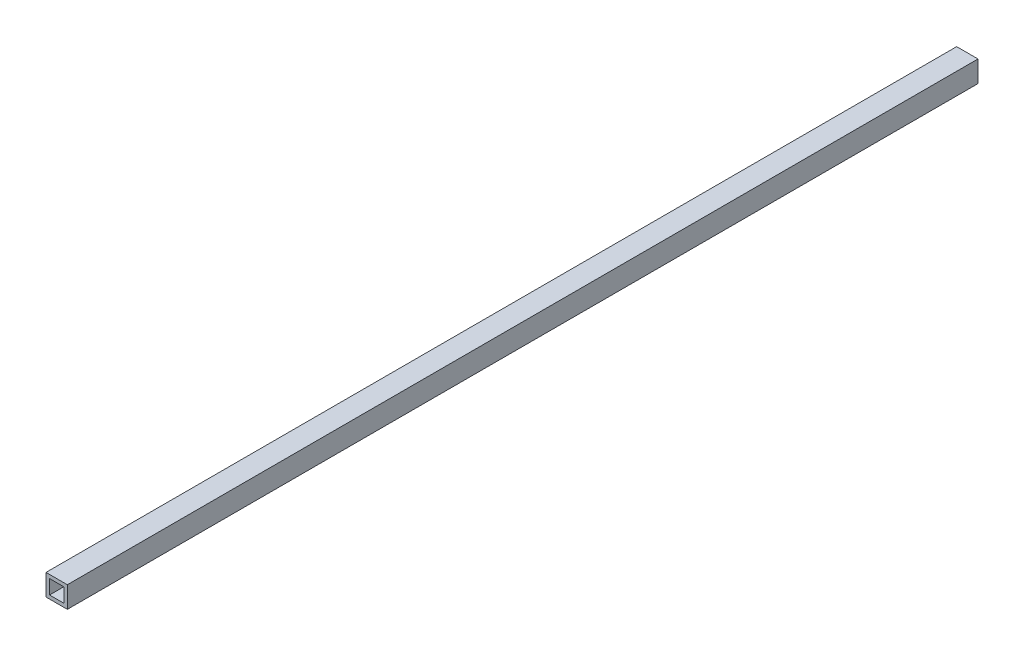
ISO-10303-21;
HEADER;
FILE_DESCRIPTION(('STEP AP214'),'2;1');
FILE_NAME('part.step','',(''),(''),'','','');
FILE_SCHEMA(('AUTOMOTIVE_DESIGN { 1 0 10303 214 1 1 1 1 }'));
ENDSEC;
DATA;
#1=APPLICATION_CONTEXT('core data for automotive mechanical design processes');
#2=APPLICATION_PROTOCOL_DEFINITION('international standard','automotive_design',2000,#1);
#3=PRODUCT_CONTEXT('',#1,'mechanical');
#4=PRODUCT('Part','Part','',(#3));
#5=PRODUCT_RELATED_PRODUCT_CATEGORY('part','',(#4));
#6=PRODUCT_DEFINITION_FORMATION('','',#4);
#7=PRODUCT_DEFINITION_CONTEXT('part definition',#1,'design');
#8=PRODUCT_DEFINITION('design','',#6,#7);
#9=PRODUCT_DEFINITION_SHAPE('','',#8);
#10=(LENGTH_UNIT() NAMED_UNIT(*) SI_UNIT(.MILLI.,.METRE.));
#11=(NAMED_UNIT(*) PLANE_ANGLE_UNIT() SI_UNIT($,.RADIAN.));
#12=(NAMED_UNIT(*) SI_UNIT($,.STERADIAN.) SOLID_ANGLE_UNIT());
#13=UNCERTAINTY_MEASURE_WITH_UNIT(LENGTH_MEASURE(1.E-05),#10,'distance_accuracy_value','');
#14=(GEOMETRIC_REPRESENTATION_CONTEXT(3) GLOBAL_UNCERTAINTY_ASSIGNED_CONTEXT((#13)) GLOBAL_UNIT_ASSIGNED_CONTEXT((#10,
#11,#12)) REPRESENTATION_CONTEXT('',''));
#15=CARTESIAN_POINT('',(0.,0.,0.));
#16=DIRECTION('',(0.,0.,1.));
#17=DIRECTION('',(1.,0.,0.));
#18=AXIS2_PLACEMENT_3D('',#15,#16,#17);
#19=CARTESIAN_POINT('',(392.168972332016,203.2,812.8));
#20=DIRECTION('',(1.,0.,0.));
#21=DIRECTION('',(0.,1.,0.));
#22=AXIS2_PLACEMENT_3D('',#19,#20,#21);
#23=PLANE('',#22);
#24=DIRECTION('',(0.,-1.,0.));
#25=VECTOR('',#24,1.);
#26=CARTESIAN_POINT('',(392.168972332016,203.2,0.));
#27=LINE('',#26,#25);
#28=CARTESIAN_POINT('',(392.168972332016,203.2,0.));
#29=VERTEX_POINT('',#28);
#30=CARTESIAN_POINT('',(392.168972332016,184.15,0.));
#31=VERTEX_POINT('',#30);
#32=EDGE_CURVE('E130',#29,#31,#27,.T.);
#33=ORIENTED_EDGE('',*,*,#32,.T.);
#34=DIRECTION('',(0.,0.,-1.));
#35=VECTOR('',#34,1.);
#36=CARTESIAN_POINT('',(392.168972332016,184.15,812.8));
#37=LINE('',#36,#35);
#38=CARTESIAN_POINT('',(392.168972332016,184.15,812.8));
#39=VERTEX_POINT('',#38);
#40=EDGE_CURVE('E11',#39,#31,#37,.T.);
#41=ORIENTED_EDGE('',*,*,#40,.F.);
#42=DIRECTION('',(0.,-1.,0.));
#43=VECTOR('',#42,1.);
#44=CARTESIAN_POINT('',(392.168972332016,203.2,812.8));
#45=LINE('',#44,#43);
#46=CARTESIAN_POINT('',(392.168972332016,203.2,812.8));
#47=VERTEX_POINT('',#46);
#48=EDGE_CURVE('E134',#47,#39,#45,.T.);
#49=ORIENTED_EDGE('',*,*,#48,.F.);
#50=DIRECTION('',(0.,0.,-1.));
#51=VECTOR('',#50,1.);
#52=CARTESIAN_POINT('',(392.168972332016,203.2,812.8));
#53=LINE('',#52,#51);
#54=EDGE_CURVE('E144',#47,#29,#53,.T.);
#55=ORIENTED_EDGE('',*,*,#54,.T.);
#56=EDGE_LOOP('',(#33,#41,#49,#55));
#57=FACE_BOUND('',#56,.T.);
#58=ADVANCED_FACE('F33',(#57),#23,.F.);
#59=CARTESIAN_POINT('',(392.168972332016,184.15,812.8));
#60=DIRECTION('',(0.,1.,0.));
#61=DIRECTION('',(-1.,0.,0.));
#62=AXIS2_PLACEMENT_3D('',#59,#60,#61);
#63=PLANE('',#62);
#64=DIRECTION('',(1.,0.,0.));
#65=VECTOR('',#64,1.);
#66=CARTESIAN_POINT('',(392.168972332016,184.15,0.));
#67=LINE('',#66,#65);
#68=CARTESIAN_POINT('',(411.218972332016,184.15,0.));
#69=VERTEX_POINT('',#68);
#70=EDGE_CURVE('E147',#31,#69,#67,.T.);
#71=ORIENTED_EDGE('',*,*,#70,.T.);
#72=DIRECTION('',(0.,0.,-1.));
#73=VECTOR('',#72,1.);
#74=CARTESIAN_POINT('',(411.218972332016,184.15,812.8));
#75=LINE('',#74,#73);
#76=CARTESIAN_POINT('',(411.218972332016,184.15,812.8));
#77=VERTEX_POINT('',#76);
#78=EDGE_CURVE('E40',#77,#69,#75,.T.);
#79=ORIENTED_EDGE('',*,*,#78,.F.);
#80=DIRECTION('',(1.,0.,0.));
#81=VECTOR('',#80,1.);
#82=CARTESIAN_POINT('',(392.168972332016,184.15,812.8));
#83=LINE('',#82,#81);
#84=EDGE_CURVE('E137',#39,#77,#83,.T.);
#85=ORIENTED_EDGE('',*,*,#84,.F.);
#86=ORIENTED_EDGE('',*,*,#40,.T.);
#87=EDGE_LOOP('',(#71,#79,#85,#86));
#88=FACE_BOUND('',#87,.T.);
#89=ADVANCED_FACE('F175',(#88),#63,.F.);
#90=CARTESIAN_POINT('',(411.218972332016,203.2,812.8));
#91=DIRECTION('',(-1.,0.,0.));
#92=DIRECTION('',(0.,-1.,0.));
#93=AXIS2_PLACEMENT_3D('',#90,#91,#92);
#94=PLANE('',#93);
#95=DIRECTION('',(0.,1.,0.));
#96=VECTOR('',#95,1.);
#97=CARTESIAN_POINT('',(411.218972332016,203.2,0.));
#98=LINE('',#97,#96);
#99=CARTESIAN_POINT('',(411.218972332016,203.2,0.));
#100=VERTEX_POINT('',#99);
#101=EDGE_CURVE('E149',#69,#100,#98,.T.);
#102=ORIENTED_EDGE('',*,*,#101,.T.);
#103=DIRECTION('',(0.,0.,-1.));
#104=VECTOR('',#103,1.);
#105=CARTESIAN_POINT('',(411.218972332016,203.2,812.8));
#106=LINE('',#105,#104);
#107=CARTESIAN_POINT('',(411.218972332016,203.2,812.8));
#108=VERTEX_POINT('',#107);
#109=EDGE_CURVE('E154',#108,#100,#106,.T.);
#110=ORIENTED_EDGE('',*,*,#109,.F.);
#111=DIRECTION('',(0.,1.,0.));
#112=VECTOR('',#111,1.);
#113=CARTESIAN_POINT('',(411.218972332016,203.2,812.8));
#114=LINE('',#113,#112);
#115=EDGE_CURVE('E140',#77,#108,#114,.T.);
#116=ORIENTED_EDGE('',*,*,#115,.F.);
#117=ORIENTED_EDGE('',*,*,#78,.T.);
#118=EDGE_LOOP('',(#102,#110,#116,#117));
#119=FACE_BOUND('',#118,.T.);
#120=ADVANCED_FACE('F161',(#119),#94,.F.);
#121=CARTESIAN_POINT('',(392.168972332016,203.2,812.8));
#122=DIRECTION('',(0.,-1.,0.));
#123=DIRECTION('',(0.,0.,-1.));
#124=AXIS2_PLACEMENT_3D('',#121,#122,#123);
#125=PLANE('',#124);
#126=DIRECTION('',(-1.,0.,0.));
#127=VECTOR('',#126,1.);
#128=CARTESIAN_POINT('',(392.168972332016,203.2,0.));
#129=LINE('',#128,#127);
#130=EDGE_CURVE('E138',#100,#29,#129,.T.);
#131=ORIENTED_EDGE('',*,*,#130,.T.);
#132=ORIENTED_EDGE('',*,*,#54,.F.);
#133=DIRECTION('',(-1.,0.,0.));
#134=VECTOR('',#133,1.);
#135=CARTESIAN_POINT('',(392.168972332016,203.2,812.8));
#136=LINE('',#135,#134);
#137=EDGE_CURVE('E142',#108,#47,#136,.T.);
#138=ORIENTED_EDGE('',*,*,#137,.F.);
#139=ORIENTED_EDGE('',*,*,#109,.T.);
#140=EDGE_LOOP('',(#131,#132,#138,#139));
#141=FACE_BOUND('',#140,.T.);
#142=ADVANCED_FACE('F170',(#141),#125,.F.);
#143=CARTESIAN_POINT('',(0.,0.,812.8));
#144=DIRECTION('',(0.,0.,1.));
#145=DIRECTION('',(1.,0.,0.));
#146=AXIS2_PLACEMENT_3D('',#143,#144,#145);
#147=PLANE('',#146);
#148=DIRECTION('',(-1.,0.,0.));
#149=VECTOR('',#148,1.);
#150=CARTESIAN_POINT('',(408.043972332016,187.325,812.8));
#151=LINE('',#150,#149);
#152=CARTESIAN_POINT('',(408.043972332016,187.325,812.8));
#153=VERTEX_POINT('',#152);
#154=CARTESIAN_POINT('',(395.343972332016,187.325,812.8));
#155=VERTEX_POINT('',#154);
#156=EDGE_CURVE('E99',#153,#155,#151,.T.);
#157=ORIENTED_EDGE('',*,*,#156,.T.);
#158=DIRECTION('',(0.,1.,0.));
#159=VECTOR('',#158,1.);
#160=CARTESIAN_POINT('',(395.343972332016,187.325,812.8));
#161=LINE('',#160,#159);
#162=CARTESIAN_POINT('',(395.343972332016,200.025,812.8));
#163=VERTEX_POINT('',#162);
#164=EDGE_CURVE('E108',#155,#163,#161,.T.);
#165=ORIENTED_EDGE('',*,*,#164,.T.);
#166=DIRECTION('',(1.,0.,0.));
#167=VECTOR('',#166,1.);
#168=CARTESIAN_POINT('',(395.343972332016,200.025,812.8));
#169=LINE('',#168,#167);
#170=CARTESIAN_POINT('',(408.043972332016,200.025,812.8));
#171=VERTEX_POINT('',#170);
#172=EDGE_CURVE('E47',#163,#171,#169,.T.);
#173=ORIENTED_EDGE('',*,*,#172,.T.);
#174=DIRECTION('',(0.,-1.,0.));
#175=VECTOR('',#174,1.);
#176=CARTESIAN_POINT('',(408.043972332016,200.025,812.8));
#177=LINE('',#176,#175);
#178=EDGE_CURVE('E105',#171,#153,#177,.T.);
#179=ORIENTED_EDGE('',*,*,#178,.T.);
#180=EDGE_LOOP('',(#157,#165,#173,#179));
#181=FACE_BOUND('',#180,.T.);
#182=ORIENTED_EDGE('',*,*,#48,.T.);
#183=ORIENTED_EDGE('',*,*,#84,.T.);
#184=ORIENTED_EDGE('',*,*,#115,.T.);
#185=ORIENTED_EDGE('',*,*,#137,.T.);
#186=EDGE_LOOP('',(#182,#183,#184,#185));
#187=FACE_BOUND('',#186,.T.);
#188=ADVANCED_FACE('F112',(#181,#187),#147,.T.);
#189=CARTESIAN_POINT('',(0.,0.,0.));
#190=DIRECTION('',(0.,0.,1.));
#191=DIRECTION('',(1.,0.,0.));
#192=AXIS2_PLACEMENT_3D('',#189,#190,#191);
#193=PLANE('',#192);
#194=DIRECTION('',(0.,1.,0.));
#195=VECTOR('',#194,1.);
#196=CARTESIAN_POINT('',(395.343972332016,187.325,0.));
#197=LINE('',#196,#195);
#198=CARTESIAN_POINT('',(395.343972332016,187.325,0.));
#199=VERTEX_POINT('',#198);
#200=CARTESIAN_POINT('',(395.343972332016,200.025,0.));
#201=VERTEX_POINT('',#200);
#202=EDGE_CURVE('E124',#199,#201,#197,.T.);
#203=ORIENTED_EDGE('',*,*,#202,.F.);
#204=DIRECTION('',(-1.,0.,0.));
#205=VECTOR('',#204,1.);
#206=CARTESIAN_POINT('',(408.043972332016,187.325,0.));
#207=LINE('',#206,#205);
#208=CARTESIAN_POINT('',(408.043972332016,187.325,0.));
#209=VERTEX_POINT('',#208);
#210=EDGE_CURVE('E55',#209,#199,#207,.T.);
#211=ORIENTED_EDGE('',*,*,#210,.F.);
#212=DIRECTION('',(0.,-1.,0.));
#213=VECTOR('',#212,1.);
#214=CARTESIAN_POINT('',(408.043972332016,200.025,0.));
#215=LINE('',#214,#213);
#216=CARTESIAN_POINT('',(408.043972332016,200.025,0.));
#217=VERTEX_POINT('',#216);
#218=EDGE_CURVE('E115',#217,#209,#215,.T.);
#219=ORIENTED_EDGE('',*,*,#218,.F.);
#220=DIRECTION('',(1.,0.,0.));
#221=VECTOR('',#220,1.);
#222=CARTESIAN_POINT('',(395.343972332016,200.025,0.));
#223=LINE('',#222,#221);
#224=EDGE_CURVE('E118',#201,#217,#223,.T.);
#225=ORIENTED_EDGE('',*,*,#224,.F.);
#226=EDGE_LOOP('',(#203,#211,#219,#225));
#227=FACE_BOUND('',#226,.T.);
#228=ORIENTED_EDGE('',*,*,#32,.F.);
#229=ORIENTED_EDGE('',*,*,#130,.F.);
#230=ORIENTED_EDGE('',*,*,#101,.F.);
#231=ORIENTED_EDGE('',*,*,#70,.F.);
#232=EDGE_LOOP('',(#228,#229,#230,#231));
#233=FACE_BOUND('',#232,.T.);
#234=ADVANCED_FACE('F167',(#227,#233),#193,.F.);
#235=CARTESIAN_POINT('',(408.043972332016,187.325,812.8));
#236=DIRECTION('',(0.,-1.,0.));
#237=DIRECTION('',(1.,0.,0.));
#238=AXIS2_PLACEMENT_3D('',#235,#236,#237);
#239=PLANE('',#238);
#240=ORIENTED_EDGE('',*,*,#210,.T.);
#241=DIRECTION('',(0.,0.,-1.));
#242=VECTOR('',#241,1.);
#243=CARTESIAN_POINT('',(395.343972332016,187.325,812.8));
#244=LINE('',#243,#242);
#245=EDGE_CURVE('E95',#155,#199,#244,.T.);
#246=ORIENTED_EDGE('',*,*,#245,.F.);
#247=ORIENTED_EDGE('',*,*,#156,.F.);
#248=DIRECTION('',(0.,0.,-1.));
#249=VECTOR('',#248,1.);
#250=CARTESIAN_POINT('',(408.043972332016,187.325,812.8));
#251=LINE('',#250,#249);
#252=EDGE_CURVE('E128',#153,#209,#251,.T.);
#253=ORIENTED_EDGE('',*,*,#252,.T.);
#254=EDGE_LOOP('',(#240,#246,#247,#253));
#255=FACE_BOUND('',#254,.T.);
#256=ADVANCED_FACE('F97',(#255),#239,.F.);
#257=CARTESIAN_POINT('',(408.043972332016,200.025,812.8));
#258=DIRECTION('',(1.,0.,0.));
#259=DIRECTION('',(0.,1.,0.));
#260=AXIS2_PLACEMENT_3D('',#257,#258,#259);
#261=PLANE('',#260);
#262=ORIENTED_EDGE('',*,*,#218,.T.);
#263=ORIENTED_EDGE('',*,*,#252,.F.);
#264=ORIENTED_EDGE('',*,*,#178,.F.);
#265=DIRECTION('',(0.,0.,-1.));
#266=VECTOR('',#265,1.);
#267=CARTESIAN_POINT('',(408.043972332016,200.025,812.8));
#268=LINE('',#267,#266);
#269=EDGE_CURVE('E131',#171,#217,#268,.T.);
#270=ORIENTED_EDGE('',*,*,#269,.T.);
#271=EDGE_LOOP('',(#262,#263,#264,#270));
#272=FACE_BOUND('',#271,.T.);
#273=ADVANCED_FACE('F192',(#272),#261,.F.);
#274=CARTESIAN_POINT('',(395.343972332016,200.025,812.8));
#275=DIRECTION('',(0.,1.,0.));
#276=DIRECTION('',(0.,0.,1.));
#277=AXIS2_PLACEMENT_3D('',#274,#275,#276);
#278=PLANE('',#277);
#279=ORIENTED_EDGE('',*,*,#224,.T.);
#280=ORIENTED_EDGE('',*,*,#269,.F.);
#281=ORIENTED_EDGE('',*,*,#172,.F.);
#282=DIRECTION('',(0.,0.,-1.));
#283=VECTOR('',#282,1.);
#284=CARTESIAN_POINT('',(395.343972332016,200.025,812.8));
#285=LINE('',#284,#283);
#286=EDGE_CURVE('E104',#163,#201,#285,.T.);
#287=ORIENTED_EDGE('',*,*,#286,.T.);
#288=EDGE_LOOP('',(#279,#280,#281,#287));
#289=FACE_BOUND('',#288,.T.);
#290=ADVANCED_FACE('F195',(#289),#278,.F.);
#291=CARTESIAN_POINT('',(395.343972332016,187.325,812.8));
#292=DIRECTION('',(-1.,0.,0.));
#293=DIRECTION('',(0.,-1.,0.));
#294=AXIS2_PLACEMENT_3D('',#291,#292,#293);
#295=PLANE('',#294);
#296=ORIENTED_EDGE('',*,*,#202,.T.);
#297=ORIENTED_EDGE('',*,*,#286,.F.);
#298=ORIENTED_EDGE('',*,*,#164,.F.);
#299=ORIENTED_EDGE('',*,*,#245,.T.);
#300=EDGE_LOOP('',(#296,#297,#298,#299));
#301=FACE_BOUND('',#300,.T.);
#302=ADVANCED_FACE('F109',(#301),#295,.F.);
#303=CLOSED_SHELL('',(#58,#89,#120,#142,#188,#234,#256,#273,#290,#302));
#304=MANIFOLD_SOLID_BREP('B2',#303);
#305=ADVANCED_BREP_SHAPE_REPRESENTATION('',(#18,#304),#14);
#306=SHAPE_DEFINITION_REPRESENTATION(#9,#305);
ENDSEC;
END-ISO-10303-21;
